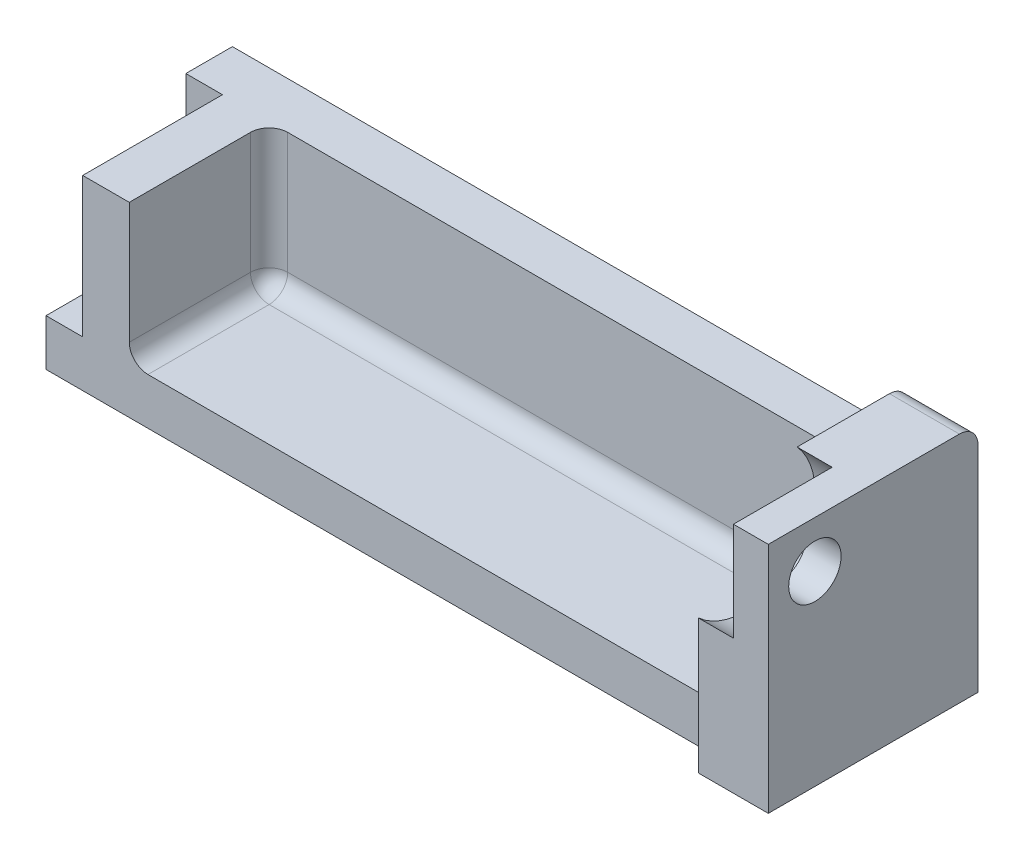
ISO-10303-21;
HEADER;
FILE_DESCRIPTION(('STEP AP214'),'2;1');
FILE_NAME('part.step','',(''),(''),'','','');
FILE_SCHEMA(('AUTOMOTIVE_DESIGN { 1 0 10303 214 1 1 1 1 }'));
ENDSEC;
DATA;
#1=APPLICATION_CONTEXT('core data for automotive mechanical design processes');
#2=APPLICATION_PROTOCOL_DEFINITION('international standard','automotive_design',2000,#1);
#3=PRODUCT_CONTEXT('',#1,'mechanical');
#4=PRODUCT('Part','Part','',(#3));
#5=PRODUCT_RELATED_PRODUCT_CATEGORY('part','',(#4));
#6=PRODUCT_DEFINITION_FORMATION('','',#4);
#7=PRODUCT_DEFINITION_CONTEXT('part definition',#1,'design');
#8=PRODUCT_DEFINITION('design','',#6,#7);
#9=PRODUCT_DEFINITION_SHAPE('','',#8);
#10=(LENGTH_UNIT() NAMED_UNIT(*) SI_UNIT(.MILLI.,.METRE.));
#11=(NAMED_UNIT(*) PLANE_ANGLE_UNIT() SI_UNIT($,.RADIAN.));
#12=(NAMED_UNIT(*) SI_UNIT($,.STERADIAN.) SOLID_ANGLE_UNIT());
#13=UNCERTAINTY_MEASURE_WITH_UNIT(LENGTH_MEASURE(1.E-05),#10,'distance_accuracy_value','');
#14=(GEOMETRIC_REPRESENTATION_CONTEXT(3) GLOBAL_UNCERTAINTY_ASSIGNED_CONTEXT((#13)) GLOBAL_UNIT_ASSIGNED_CONTEXT((#10,
#11,#12)) REPRESENTATION_CONTEXT('',''));
#15=CARTESIAN_POINT('',(0.,0.,0.));
#16=DIRECTION('',(0.,0.,1.));
#17=DIRECTION('',(1.,0.,0.));
#18=AXIS2_PLACEMENT_3D('',#15,#16,#17);
#19=CARTESIAN_POINT('',(-66.8759493670886,63.2320675105485,25.4));
#20=DIRECTION('',(0.,-1.,0.));
#21=DIRECTION('',(0.,0.,-1.));
#22=AXIS2_PLACEMENT_3D('',#19,#20,#21);
#23=PLANE('',#22);
#24=DIRECTION('',(-1.,0.,0.));
#25=VECTOR('',#24,1.);
#26=CARTESIAN_POINT('',(-55.5259493670886,63.2320675105485,6.35));
#27=LINE('',#26,#25);
#28=CARTESIAN_POINT('',(22.6590506329114,63.2320675105485,6.35));
#29=VERTEX_POINT('',#28);
#30=CARTESIAN_POINT('',(-52.9859493670886,63.2320675105485,6.35));
#31=VERTEX_POINT('',#30);
#32=EDGE_CURVE('E262',#29,#31,#27,.T.);
#33=ORIENTED_EDGE('',*,*,#32,.F.);
#34=DIRECTION('',(0.,0.,1.));
#35=VECTOR('',#34,1.);
#36=CARTESIAN_POINT('',(22.6590506329114,63.2320675105485,0.));
#37=LINE('',#36,#35);
#38=CARTESIAN_POINT('',(22.6590506329114,63.2320675105485,0.));
#39=VERTEX_POINT('',#38);
#40=EDGE_CURVE('E59',#29,#39,#37,.F.);
#41=ORIENTED_EDGE('',*,*,#40,.T.);
#42=DIRECTION('',(-1.,0.,0.));
#43=VECTOR('',#42,1.);
#44=CARTESIAN_POINT('',(-66.8759493670886,63.2320675105485,0.));
#45=LINE('',#44,#43);
#46=CARTESIAN_POINT('',(-66.8759493670886,63.2320675105485,0.));
#47=VERTEX_POINT('',#46);
#48=EDGE_CURVE('E272',#39,#47,#45,.T.);
#49=ORIENTED_EDGE('',*,*,#48,.T.);
#50=DIRECTION('',(0.,0.,-1.));
#51=VECTOR('',#50,1.);
#52=CARTESIAN_POINT('',(-66.8759493670886,63.2320675105485,25.4));
#53=LINE('',#52,#51);
#54=CARTESIAN_POINT('',(-66.8759493670886,63.2320675105485,6.35));
#55=VERTEX_POINT('',#54);
#56=EDGE_CURVE('E278',#55,#47,#53,.T.);
#57=ORIENTED_EDGE('',*,*,#56,.F.);
#58=DIRECTION('',(-1.,0.,0.));
#59=VECTOR('',#58,1.);
#60=CARTESIAN_POINT('',(-61.8759493670886,63.2320675105485,6.35));
#61=LINE('',#60,#59);
#62=CARTESIAN_POINT('',(-61.8759493670886,63.2320675105485,6.35));
#63=VERTEX_POINT('',#62);
#64=EDGE_CURVE('E247',#63,#55,#61,.T.);
#65=ORIENTED_EDGE('',*,*,#64,.F.);
#66=DIRECTION('',(0.,0.,-1.));
#67=VECTOR('',#66,1.);
#68=CARTESIAN_POINT('',(-61.8759493670886,63.2320675105485,25.4));
#69=LINE('',#68,#67);
#70=CARTESIAN_POINT('',(-61.8759493670886,63.2320675105485,25.4));
#71=VERTEX_POINT('',#70);
#72=EDGE_CURVE('E238',#71,#63,#69,.T.);
#73=ORIENTED_EDGE('',*,*,#72,.F.);
#74=DIRECTION('',(-1.,0.,0.));
#75=VECTOR('',#74,1.);
#76=CARTESIAN_POINT('',(-66.8759493670886,63.2320675105485,25.4));
#77=LINE('',#76,#75);
#78=CARTESIAN_POINT('',(-55.5259493670886,63.2320675105485,25.4));
#79=VERTEX_POINT('',#78);
#80=EDGE_CURVE('E275',#79,#71,#77,.T.);
#81=ORIENTED_EDGE('',*,*,#80,.F.);
#82=DIRECTION('',(0.,0.,1.));
#83=VECTOR('',#82,1.);
#84=CARTESIAN_POINT('',(-55.5259493670886,63.2320675105485,25.4));
#85=LINE('',#84,#83);
#86=CARTESIAN_POINT('',(-55.5259493670886,63.2320675105485,8.89));
#87=VERTEX_POINT('',#86);
#88=EDGE_CURVE('E254',#87,#79,#85,.T.);
#89=ORIENTED_EDGE('',*,*,#88,.F.);
#90=CARTESIAN_POINT('',(-52.9859493670886,63.2320675105485,8.89));
#91=DIRECTION('',(0.,-1.,0.));
#92=DIRECTION('',(0.,0.,-1.));
#93=AXIS2_PLACEMENT_3D('',#90,#91,#92);
#94=CIRCLE('',#93,2.54);
#95=EDGE_CURVE('E329',#87,#31,#94,.T.);
#96=ORIENTED_EDGE('',*,*,#95,.T.);
#97=EDGE_LOOP('',(#33,#41,#49,#57,#65,#73,#81,#89,#96));
#98=FACE_BOUND('',#97,.T.);
#99=ADVANCED_FACE('F34',(#98),#23,.F.);
#100=CARTESIAN_POINT('',(-66.8759493670886,63.2320675105485,25.4));
#101=DIRECTION('',(1.,0.,0.));
#102=DIRECTION('',(0.,1.,0.));
#103=AXIS2_PLACEMENT_3D('',#100,#101,#102);
#104=PLANE('',#103);
#105=DIRECTION('',(0.,-1.,0.));
#106=VECTOR('',#105,1.);
#107=CARTESIAN_POINT('',(-66.8759493670886,63.2320675105485,25.4));
#108=LINE('',#107,#106);
#109=CARTESIAN_POINT('',(-66.8759493670886,44.1820675105485,25.4));
#110=VERTEX_POINT('',#109);
#111=CARTESIAN_POINT('',(-66.8759493670886,37.8320675105485,25.4));
#112=VERTEX_POINT('',#111);
#113=EDGE_CURVE('E269',#110,#112,#108,.T.);
#114=ORIENTED_EDGE('',*,*,#113,.F.);
#115=DIRECTION('',(0.,0.,1.));
#116=VECTOR('',#115,1.);
#117=CARTESIAN_POINT('',(-66.8759493670886,44.1820675105485,25.4));
#118=LINE('',#117,#116);
#119=CARTESIAN_POINT('',(-66.8759493670886,44.1820675105485,6.35));
#120=VERTEX_POINT('',#119);
#121=EDGE_CURVE('E239',#120,#110,#118,.T.);
#122=ORIENTED_EDGE('',*,*,#121,.F.);
#123=DIRECTION('',(0.,-1.,0.));
#124=VECTOR('',#123,1.);
#125=CARTESIAN_POINT('',(-66.8759493670886,63.2320675105485,6.35));
#126=LINE('',#125,#124);
#127=EDGE_CURVE('E235',#55,#120,#126,.T.);
#128=ORIENTED_EDGE('',*,*,#127,.F.);
#129=ORIENTED_EDGE('',*,*,#56,.T.);
#130=DIRECTION('',(0.,-1.,0.));
#131=VECTOR('',#130,1.);
#132=CARTESIAN_POINT('',(-66.8759493670886,63.2320675105485,0.));
#133=LINE('',#132,#131);
#134=CARTESIAN_POINT('',(-66.8759493670886,37.8320675105485,0.));
#135=VERTEX_POINT('',#134);
#136=EDGE_CURVE('E268',#47,#135,#133,.T.);
#137=ORIENTED_EDGE('',*,*,#136,.T.);
#138=DIRECTION('',(0.,0.,-1.));
#139=VECTOR('',#138,1.);
#140=CARTESIAN_POINT('',(-66.8759493670886,37.8320675105485,25.4));
#141=LINE('',#140,#139);
#142=EDGE_CURVE('E192',#112,#135,#141,.T.);
#143=ORIENTED_EDGE('',*,*,#142,.F.);
#144=EDGE_LOOP('',(#114,#122,#128,#129,#137,#143));
#145=FACE_BOUND('',#144,.T.);
#146=ADVANCED_FACE('F420',(#145),#104,.F.);
#147=CARTESIAN_POINT('',(-66.8759493670886,37.8320675105485,25.4));
#148=DIRECTION('',(0.,1.,0.));
#149=DIRECTION('',(0.,0.,1.));
#150=AXIS2_PLACEMENT_3D('',#147,#148,#149);
#151=PLANE('',#150);
#152=DIRECTION('',(1.,0.,0.));
#153=VECTOR('',#152,1.);
#154=CARTESIAN_POINT('',(-66.8759493670886,37.8320675105485,0.));
#155=LINE('',#154,#153);
#156=CARTESIAN_POINT('',(34.7240506329114,37.8320675105485,0.));
#157=VERTEX_POINT('',#156);
#158=EDGE_CURVE('E281',#135,#157,#155,.T.);
#159=ORIENTED_EDGE('',*,*,#158,.T.);
#160=DIRECTION('',(0.,0.,-1.));
#161=VECTOR('',#160,1.);
#162=CARTESIAN_POINT('',(34.7240506329114,37.8320675105485,25.4));
#163=LINE('',#162,#161);
#164=CARTESIAN_POINT('',(34.7240506329114,37.8320675105485,28.575));
#165=VERTEX_POINT('',#164);
#166=EDGE_CURVE('E288',#165,#157,#163,.T.);
#167=ORIENTED_EDGE('',*,*,#166,.F.);
#168=DIRECTION('',(1.,0.,0.));
#169=VECTOR('',#168,1.);
#170=CARTESIAN_POINT('',(25.1990506329114,37.8320675105485,28.575));
#171=LINE('',#170,#169);
#172=CARTESIAN_POINT('',(25.1990506329114,37.8320675105485,28.575));
#173=VERTEX_POINT('',#172);
#174=EDGE_CURVE('E226',#173,#165,#171,.T.);
#175=ORIENTED_EDGE('',*,*,#174,.F.);
#176=DIRECTION('',(0.,0.,-1.));
#177=VECTOR('',#176,1.);
#178=CARTESIAN_POINT('',(25.1990506329114,37.8320675105485,28.575));
#179=LINE('',#178,#177);
#180=CARTESIAN_POINT('',(25.1990506329114,37.8320675105485,27.94));
#181=VERTEX_POINT('',#180);
#182=EDGE_CURVE('E232',#173,#181,#179,.T.);
#183=ORIENTED_EDGE('',*,*,#182,.T.);
#184=CARTESIAN_POINT('',(22.6590506329114,37.8320675105485,27.94));
#185=DIRECTION('',(0.,1.,0.));
#186=DIRECTION('',(0.,0.,1.));
#187=AXIS2_PLACEMENT_3D('',#184,#185,#186);
#188=CIRCLE('',#187,2.54);
#189=CARTESIAN_POINT('',(22.6590506329114,37.8320675105485,25.4));
#190=VERTEX_POINT('',#189);
#191=EDGE_CURVE('E43',#181,#190,#188,.T.);
#192=ORIENTED_EDGE('',*,*,#191,.T.);
#193=DIRECTION('',(1.,0.,0.));
#194=VECTOR('',#193,1.);
#195=CARTESIAN_POINT('',(-66.8759493670886,37.8320675105485,25.4));
#196=LINE('',#195,#194);
#197=EDGE_CURVE('E271',#112,#190,#196,.T.);
#198=ORIENTED_EDGE('',*,*,#197,.F.);
#199=ORIENTED_EDGE('',*,*,#142,.T.);
#200=EDGE_LOOP('',(#159,#167,#175,#183,#192,#198,#199));
#201=FACE_BOUND('',#200,.T.);
#202=ADVANCED_FACE('F373',(#201),#151,.F.);
#203=CARTESIAN_POINT('',(34.7240506329114,63.2320675105485,25.4));
#204=DIRECTION('',(-1.,0.,0.));
#205=DIRECTION('',(0.,-1.,0.));
#206=AXIS2_PLACEMENT_3D('',#203,#204,#205);
#207=PLANE('',#206);
#208=CARTESIAN_POINT('',(34.7240506329114,63.2320675105485,22.225));
#209=DIRECTION('',(-1.,0.,0.));
#210=DIRECTION('',(0.,-1.,0.));
#211=AXIS2_PLACEMENT_3D('',#208,#209,#210);
#212=CIRCLE('',#211,3.57124);
#213=CARTESIAN_POINT('',(34.7240506329114,59.6608275105485,22.225));
#214=VERTEX_POINT('',#213);
#215=EDGE_CURVE('E215',#214,#214,#212,.T.);
#216=ORIENTED_EDGE('',*,*,#215,.T.);
#217=EDGE_LOOP('',(#216));
#218=FACE_BOUND('',#217,.T.);
#219=DIRECTION('',(0.,1.,0.));
#220=VECTOR('',#219,1.);
#221=CARTESIAN_POINT('',(34.7240506329114,63.2320675105485,0.));
#222=LINE('',#221,#220);
#223=CARTESIAN_POINT('',(34.7240506329114,67.0420675105485,0.));
#224=VERTEX_POINT('',#223);
#225=EDGE_CURVE('E283',#157,#224,#222,.T.);
#226=ORIENTED_EDGE('',*,*,#225,.T.);
#227=CARTESIAN_POINT('',(34.7240506329114,67.0420675105485,2.54));
#228=DIRECTION('',(-1.,0.,0.));
#229=DIRECTION('',(0.,-1.,0.));
#230=AXIS2_PLACEMENT_3D('',#227,#228,#229);
#231=CIRCLE('',#230,2.54);
#232=CARTESIAN_POINT('',(34.7240506329114,69.5820675105485,2.54));
#233=VERTEX_POINT('',#232);
#234=EDGE_CURVE('E326',#224,#233,#231,.F.);
#235=ORIENTED_EDGE('',*,*,#234,.T.);
#236=DIRECTION('',(0.,0.,-1.));
#237=VECTOR('',#236,1.);
#238=CARTESIAN_POINT('',(34.7240506329114,69.5820675105485,0.));
#239=LINE('',#238,#237);
#240=CARTESIAN_POINT('',(34.7240506329114,69.5820675105485,28.575));
#241=VERTEX_POINT('',#240);
#242=EDGE_CURVE('E216',#241,#233,#239,.T.);
#243=ORIENTED_EDGE('',*,*,#242,.F.);
#244=DIRECTION('',(0.,1.,0.));
#245=VECTOR('',#244,1.);
#246=CARTESIAN_POINT('',(34.7240506329114,63.2320675105485,28.575));
#247=LINE('',#246,#245);
#248=EDGE_CURVE('E229',#165,#241,#247,.T.);
#249=ORIENTED_EDGE('',*,*,#248,.F.);
#250=ORIENTED_EDGE('',*,*,#166,.T.);
#251=EDGE_LOOP('',(#226,#235,#243,#249,#250));
#252=FACE_BOUND('',#251,.T.);
#253=ADVANCED_FACE('F428',(#218,#252),#207,.F.);
#254=CARTESIAN_POINT('',(0.,0.,25.4));
#255=DIRECTION('',(0.,0.,1.));
#256=DIRECTION('',(1.,0.,0.));
#257=AXIS2_PLACEMENT_3D('',#254,#255,#256);
#258=PLANE('',#257);
#259=ORIENTED_EDGE('',*,*,#197,.T.);
#260=DIRECTION('',(0.,-1.,0.));
#261=VECTOR('',#260,1.);
#262=CARTESIAN_POINT('',(22.6590506329114,0.,25.4));
#263=LINE('',#262,#261);
#264=CARTESIAN_POINT('',(22.6590506329114,44.1820675105485,25.4));
#265=VERTEX_POINT('',#264);
#266=EDGE_CURVE('E321',#190,#265,#263,.F.);
#267=ORIENTED_EDGE('',*,*,#266,.T.);
#268=DIRECTION('',(1.,0.,0.));
#269=VECTOR('',#268,1.);
#270=CARTESIAN_POINT('',(-55.5259493670886,44.1820675105485,25.4));
#271=LINE('',#270,#269);
#272=CARTESIAN_POINT('',(-52.9859493670886,44.1820675105485,25.4));
#273=VERTEX_POINT('',#272);
#274=EDGE_CURVE('E258',#273,#265,#271,.T.);
#275=ORIENTED_EDGE('',*,*,#274,.F.);
#276=CARTESIAN_POINT('',(-52.9859493670886,46.7220675105485,25.4));
#277=DIRECTION('',(0.,0.,1.));
#278=DIRECTION('',(1.,0.,0.));
#279=AXIS2_PLACEMENT_3D('',#276,#277,#278);
#280=CIRCLE('',#279,2.54);
#281=CARTESIAN_POINT('',(-55.5259493670886,46.7220675105485,25.4));
#282=VERTEX_POINT('',#281);
#283=EDGE_CURVE('E331',#273,#282,#280,.F.);
#284=ORIENTED_EDGE('',*,*,#283,.T.);
#285=DIRECTION('',(0.,1.,0.));
#286=VECTOR('',#285,1.);
#287=CARTESIAN_POINT('',(-55.5259493670886,44.1820675105485,25.4));
#288=LINE('',#287,#286);
#289=EDGE_CURVE('E261',#282,#79,#288,.T.);
#290=ORIENTED_EDGE('',*,*,#289,.T.);
#291=ORIENTED_EDGE('',*,*,#80,.T.);
#292=DIRECTION('',(0.,1.,0.));
#293=VECTOR('',#292,1.);
#294=CARTESIAN_POINT('',(-61.8759493670886,63.2320675105485,25.4));
#295=LINE('',#294,#293);
#296=CARTESIAN_POINT('',(-61.8759493670886,44.1820675105485,25.4));
#297=VERTEX_POINT('',#296);
#298=EDGE_CURVE('E236',#297,#71,#295,.T.);
#299=ORIENTED_EDGE('',*,*,#298,.F.);
#300=DIRECTION('',(-1.,0.,0.));
#301=VECTOR('',#300,1.);
#302=CARTESIAN_POINT('',(-61.8759493670886,44.1820675105485,25.4));
#303=LINE('',#302,#301);
#304=EDGE_CURVE('E251',#297,#110,#303,.T.);
#305=ORIENTED_EDGE('',*,*,#304,.T.);
#306=ORIENTED_EDGE('',*,*,#113,.T.);
#307=EDGE_LOOP('',(#259,#267,#275,#284,#290,#291,#299,#305,#306));
#308=FACE_BOUND('',#307,.T.);
#309=ADVANCED_FACE('F380',(#308),#258,.T.);
#310=CARTESIAN_POINT('',(0.,0.,0.));
#311=DIRECTION('',(0.,0.,1.));
#312=DIRECTION('',(1.,0.,0.));
#313=AXIS2_PLACEMENT_3D('',#310,#311,#312);
#314=PLANE('',#313);
#315=DIRECTION('',(0.,-1.,0.));
#316=VECTOR('',#315,1.);
#317=CARTESIAN_POINT('',(25.1990506329114,69.5820675105485,0.));
#318=LINE('',#317,#316);
#319=CARTESIAN_POINT('',(25.1990506329114,67.0420675105485,0.));
#320=VERTEX_POINT('',#319);
#321=CARTESIAN_POINT('',(25.1990506329114,65.7720675105485,0.));
#322=VERTEX_POINT('',#321);
#323=EDGE_CURVE('E221',#320,#322,#318,.T.);
#324=ORIENTED_EDGE('',*,*,#323,.F.);
#325=DIRECTION('',(-1.,0.,0.));
#326=VECTOR('',#325,1.);
#327=CARTESIAN_POINT('',(0.,67.0420675105485,0.));
#328=LINE('',#327,#326);
#329=EDGE_CURVE('E51',#320,#224,#328,.F.);
#330=ORIENTED_EDGE('',*,*,#329,.T.);
#331=ORIENTED_EDGE('',*,*,#225,.F.);
#332=ORIENTED_EDGE('',*,*,#158,.F.);
#333=ORIENTED_EDGE('',*,*,#136,.F.);
#334=ORIENTED_EDGE('',*,*,#48,.F.);
#335=CARTESIAN_POINT('',(22.6590506329114,65.7720675105485,0.));
#336=DIRECTION('',(0.,0.,1.));
#337=DIRECTION('',(1.,0.,0.));
#338=AXIS2_PLACEMENT_3D('',#335,#336,#337);
#339=CIRCLE('',#338,2.54);
#340=EDGE_CURVE('E11',#39,#322,#339,.T.);
#341=ORIENTED_EDGE('',*,*,#340,.T.);
#342=EDGE_LOOP('',(#324,#330,#331,#332,#333,#334,#341));
#343=FACE_BOUND('',#342,.T.);
#344=ADVANCED_FACE('F424',(#343),#314,.F.);
#345=CARTESIAN_POINT('',(-55.5259493670886,44.1820675105485,25.4));
#346=DIRECTION('',(-1.,0.,0.));
#347=DIRECTION('',(0.,0.,1.));
#348=AXIS2_PLACEMENT_3D('',#345,#346,#347);
#349=PLANE('',#348);
#350=DIRECTION('',(0.,0.,1.));
#351=VECTOR('',#350,1.);
#352=CARTESIAN_POINT('',(-55.5259493670886,46.7220675105485,6.35));
#353=LINE('',#352,#351);
#354=CARTESIAN_POINT('',(-55.5259493670886,46.7220675105485,8.89));
#355=VERTEX_POINT('',#354);
#356=EDGE_CURVE('E191',#282,#355,#353,.F.);
#357=ORIENTED_EDGE('',*,*,#356,.T.);
#358=DIRECTION('',(0.,1.,0.));
#359=VECTOR('',#358,1.);
#360=CARTESIAN_POINT('',(-55.5259493670886,63.2320675105485,8.89));
#361=LINE('',#360,#359);
#362=EDGE_CURVE('E296',#355,#87,#361,.T.);
#363=ORIENTED_EDGE('',*,*,#362,.T.);
#364=ORIENTED_EDGE('',*,*,#88,.T.);
#365=ORIENTED_EDGE('',*,*,#289,.F.);
#366=EDGE_LOOP('',(#357,#363,#364,#365));
#367=FACE_BOUND('',#366,.T.);
#368=ADVANCED_FACE('F404',(#367),#349,.F.);
#369=CARTESIAN_POINT('',(-55.5259493670886,44.1820675105485,6.35));
#370=DIRECTION('',(0.,0.,-1.));
#371=DIRECTION('',(-1.,0.,0.));
#372=AXIS2_PLACEMENT_3D('',#369,#370,#371);
#373=PLANE('',#372);
#374=ORIENTED_EDGE('',*,*,#32,.T.);
#375=DIRECTION('',(0.,1.,0.));
#376=VECTOR('',#375,1.);
#377=CARTESIAN_POINT('',(-52.9859493670886,44.1820675105485,6.35));
#378=LINE('',#377,#376);
#379=CARTESIAN_POINT('',(-52.9859493670886,46.7220675105485,6.35));
#380=VERTEX_POINT('',#379);
#381=EDGE_CURVE('E303',#31,#380,#378,.F.);
#382=ORIENTED_EDGE('',*,*,#381,.T.);
#383=DIRECTION('',(-1.,0.,0.));
#384=VECTOR('',#383,1.);
#385=CARTESIAN_POINT('',(25.1990506329114,46.7220675105485,6.35));
#386=LINE('',#385,#384);
#387=CARTESIAN_POINT('',(22.6590506329114,46.7220675105485,6.35));
#388=VERTEX_POINT('',#387);
#389=EDGE_CURVE('E301',#380,#388,#386,.F.);
#390=ORIENTED_EDGE('',*,*,#389,.T.);
#391=DIRECTION('',(0.,1.,0.));
#392=VECTOR('',#391,1.);
#393=CARTESIAN_POINT('',(22.6590506329114,63.2320675105485,6.35));
#394=LINE('',#393,#392);
#395=EDGE_CURVE('E299',#388,#29,#394,.T.);
#396=ORIENTED_EDGE('',*,*,#395,.T.);
#397=EDGE_LOOP('',(#374,#382,#390,#396));
#398=FACE_BOUND('',#397,.T.);
#399=ADVANCED_FACE('F579',(#398),#373,.F.);
#400=CARTESIAN_POINT('',(25.1990506329114,44.1820675105485,25.4));
#401=DIRECTION('',(1.,0.,0.));
#402=DIRECTION('',(0.,0.,-1.));
#403=AXIS2_PLACEMENT_3D('',#400,#401,#402);
#404=PLANE('',#403);
#405=DIRECTION('',(0.,0.,1.));
#406=VECTOR('',#405,1.);
#407=CARTESIAN_POINT('',(25.1990506329114,69.5820675105485,0.));
#408=LINE('',#407,#406);
#409=CARTESIAN_POINT('',(25.1990506329114,69.5820675105485,2.54));
#410=VERTEX_POINT('',#409);
#411=CARTESIAN_POINT('',(25.1990506329114,69.5820675105485,15.1254841714382));
#412=VERTEX_POINT('',#411);
#413=EDGE_CURVE('E208',#410,#412,#408,.T.);
#414=ORIENTED_EDGE('',*,*,#413,.F.);
#415=CARTESIAN_POINT('',(25.1990506329114,67.0420675105485,2.54));
#416=DIRECTION('',(1.,0.,0.));
#417=DIRECTION('',(0.,0.,-1.));
#418=AXIS2_PLACEMENT_3D('',#415,#416,#417);
#419=CIRCLE('',#418,2.54);
#420=EDGE_CURVE('E319',#410,#320,#419,.F.);
#421=ORIENTED_EDGE('',*,*,#420,.T.);
#422=ORIENTED_EDGE('',*,*,#323,.T.);
#423=DIRECTION('',(0.,0.,1.));
#424=VECTOR('',#423,1.);
#425=CARTESIAN_POINT('',(25.1990506329114,65.7720675105485,6.35));
#426=LINE('',#425,#424);
#427=CARTESIAN_POINT('',(25.1990506329114,65.7720675105485,8.89));
#428=VERTEX_POINT('',#427);
#429=EDGE_CURVE('E311',#322,#428,#426,.T.);
#430=ORIENTED_EDGE('',*,*,#429,.T.);
#431=DIRECTION('',(0.,1.,0.));
#432=VECTOR('',#431,1.);
#433=CARTESIAN_POINT('',(25.1990506329114,44.1820675105485,8.89));
#434=LINE('',#433,#432);
#435=CARTESIAN_POINT('',(25.1990506329114,46.7220675105485,8.89));
#436=VERTEX_POINT('',#435);
#437=EDGE_CURVE('E313',#428,#436,#434,.F.);
#438=ORIENTED_EDGE('',*,*,#437,.T.);
#439=DIRECTION('',(0.,0.,-1.));
#440=VECTOR('',#439,1.);
#441=CARTESIAN_POINT('',(25.1990506329114,46.7220675105485,25.4));
#442=LINE('',#441,#440);
#443=CARTESIAN_POINT('',(25.1990506329114,46.7220675105485,27.94));
#444=VERTEX_POINT('',#443);
#445=EDGE_CURVE('E315',#436,#444,#442,.F.);
#446=ORIENTED_EDGE('',*,*,#445,.T.);
#447=DIRECTION('',(0.,-1.,0.));
#448=VECTOR('',#447,1.);
#449=CARTESIAN_POINT('',(25.1990506329114,44.1820675105485,27.94));
#450=LINE('',#449,#448);
#451=EDGE_CURVE('E317',#444,#181,#450,.T.);
#452=ORIENTED_EDGE('',*,*,#451,.T.);
#453=ORIENTED_EDGE('',*,*,#182,.F.);
#454=DIRECTION('',(0.,-1.,0.));
#455=VECTOR('',#454,1.);
#456=CARTESIAN_POINT('',(25.1990506329114,63.2320675105485,28.575));
#457=LINE('',#456,#455);
#458=CARTESIAN_POINT('',(25.1990506329114,56.1325516819867,28.575));
#459=VERTEX_POINT('',#458);
#460=EDGE_CURVE('E224',#459,#173,#457,.T.);
#461=ORIENTED_EDGE('',*,*,#460,.F.);
#462=CARTESIAN_POINT('',(25.1990506329114,63.2320675105485,22.225));
#463=DIRECTION('',(-1.,0.,0.));
#464=DIRECTION('',(0.,0.,1.));
#465=AXIS2_PLACEMENT_3D('',#462,#463,#464);
#466=CIRCLE('',#465,9.52499999999999);
#467=EDGE_CURVE('E202',#412,#459,#466,.T.);
#468=ORIENTED_EDGE('',*,*,#467,.F.);
#469=EDGE_LOOP('',(#414,#421,#422,#430,#438,#446,#452,#453,#461,#468));
#470=FACE_BOUND('',#469,.T.);
#471=ADVANCED_FACE('F369',(#470),#404,.F.);
#472=CARTESIAN_POINT('',(0.,44.1820675105485,0.));
#473=DIRECTION('',(0.,-1.,0.));
#474=DIRECTION('',(0.,0.,-1.));
#475=AXIS2_PLACEMENT_3D('',#472,#473,#474);
#476=PLANE('',#475);
#477=DIRECTION('',(-1.,0.,0.));
#478=VECTOR('',#477,1.);
#479=CARTESIAN_POINT('',(-55.5259493670886,44.1820675105485,8.89));
#480=LINE('',#479,#478);
#481=CARTESIAN_POINT('',(22.6590506329114,44.1820675105485,8.89));
#482=VERTEX_POINT('',#481);
#483=CARTESIAN_POINT('',(-52.9859493670886,44.1820675105485,8.89));
#484=VERTEX_POINT('',#483);
#485=EDGE_CURVE('E307',#482,#484,#480,.T.);
#486=ORIENTED_EDGE('',*,*,#485,.T.);
#487=DIRECTION('',(0.,0.,1.));
#488=VECTOR('',#487,1.);
#489=CARTESIAN_POINT('',(-52.9859493670886,44.1820675105485,25.4));
#490=LINE('',#489,#488);
#491=EDGE_CURVE('E309',#484,#273,#490,.T.);
#492=ORIENTED_EDGE('',*,*,#491,.T.);
#493=ORIENTED_EDGE('',*,*,#274,.T.);
#494=DIRECTION('',(0.,0.,-1.));
#495=VECTOR('',#494,1.);
#496=CARTESIAN_POINT('',(22.6590506329114,44.1820675105485,6.35));
#497=LINE('',#496,#495);
#498=EDGE_CURVE('E305',#265,#482,#497,.T.);
#499=ORIENTED_EDGE('',*,*,#498,.T.);
#500=EDGE_LOOP('',(#486,#492,#493,#499));
#501=FACE_BOUND('',#500,.T.);
#502=ADVANCED_FACE('F383',(#501),#476,.F.);
#503=CARTESIAN_POINT('',(-61.8759493670886,44.1820675105485,25.4));
#504=DIRECTION('',(0.,-1.,0.));
#505=DIRECTION('',(1.,0.,0.));
#506=AXIS2_PLACEMENT_3D('',#503,#504,#505);
#507=PLANE('',#506);
#508=ORIENTED_EDGE('',*,*,#121,.T.);
#509=ORIENTED_EDGE('',*,*,#304,.F.);
#510=DIRECTION('',(0.,0.,1.));
#511=VECTOR('',#510,1.);
#512=CARTESIAN_POINT('',(-61.8759493670886,44.1820675105485,25.4));
#513=LINE('',#512,#511);
#514=CARTESIAN_POINT('',(-61.8759493670886,44.1820675105485,6.35));
#515=VERTEX_POINT('',#514);
#516=EDGE_CURVE('E245',#515,#297,#513,.T.);
#517=ORIENTED_EDGE('',*,*,#516,.F.);
#518=DIRECTION('',(-1.,0.,0.));
#519=VECTOR('',#518,1.);
#520=CARTESIAN_POINT('',(-61.8759493670886,44.1820675105485,6.35));
#521=LINE('',#520,#519);
#522=EDGE_CURVE('E255',#515,#120,#521,.T.);
#523=ORIENTED_EDGE('',*,*,#522,.T.);
#524=EDGE_LOOP('',(#508,#509,#517,#523));
#525=FACE_BOUND('',#524,.T.);
#526=ADVANCED_FACE('F416',(#525),#507,.F.);
#527=CARTESIAN_POINT('',(-61.8759493670886,63.2320675105485,6.35));
#528=DIRECTION('',(0.,0.,-1.));
#529=DIRECTION('',(-1.,0.,0.));
#530=AXIS2_PLACEMENT_3D('',#527,#528,#529);
#531=PLANE('',#530);
#532=ORIENTED_EDGE('',*,*,#127,.T.);
#533=ORIENTED_EDGE('',*,*,#522,.F.);
#534=DIRECTION('',(0.,-1.,0.));
#535=VECTOR('',#534,1.);
#536=CARTESIAN_POINT('',(-61.8759493670886,63.2320675105485,6.35));
#537=LINE('',#536,#535);
#538=EDGE_CURVE('E242',#63,#515,#537,.T.);
#539=ORIENTED_EDGE('',*,*,#538,.F.);
#540=ORIENTED_EDGE('',*,*,#64,.T.);
#541=EDGE_LOOP('',(#532,#533,#539,#540));
#542=FACE_BOUND('',#541,.T.);
#543=ADVANCED_FACE('F648',(#542),#531,.F.);
#544=CARTESIAN_POINT('',(-61.8759493670886,0.,0.));
#545=DIRECTION('',(1.,0.,0.));
#546=DIRECTION('',(0.,0.,-1.));
#547=AXIS2_PLACEMENT_3D('',#544,#545,#546);
#548=PLANE('',#547);
#549=ORIENTED_EDGE('',*,*,#298,.T.);
#550=ORIENTED_EDGE('',*,*,#72,.T.);
#551=ORIENTED_EDGE('',*,*,#538,.T.);
#552=ORIENTED_EDGE('',*,*,#516,.T.);
#553=EDGE_LOOP('',(#549,#550,#551,#552));
#554=FACE_BOUND('',#553,.T.);
#555=ADVANCED_FACE('F413',(#554),#548,.F.);
#556=CARTESIAN_POINT('',(0.,0.,28.575));
#557=DIRECTION('',(0.,0.,1.));
#558=DIRECTION('',(1.,0.,0.));
#559=AXIS2_PLACEMENT_3D('',#556,#557,#558);
#560=PLANE('',#559);
#561=DIRECTION('',(-1.,0.,0.));
#562=VECTOR('',#561,1.);
#563=CARTESIAN_POINT('',(25.1990506329114,56.1325516819867,28.575));
#564=LINE('',#563,#562);
#565=CARTESIAN_POINT('',(29.9742506329114,56.1325516819867,28.575));
#566=VERTEX_POINT('',#565);
#567=EDGE_CURVE('E200',#459,#566,#564,.F.);
#568=ORIENTED_EDGE('',*,*,#567,.F.);
#569=ORIENTED_EDGE('',*,*,#460,.T.);
#570=ORIENTED_EDGE('',*,*,#174,.T.);
#571=ORIENTED_EDGE('',*,*,#248,.T.);
#572=DIRECTION('',(1.,0.,0.));
#573=VECTOR('',#572,1.);
#574=CARTESIAN_POINT('',(34.7240506329114,69.5820675105485,28.575));
#575=LINE('',#574,#573);
#576=CARTESIAN_POINT('',(29.9742506329114,69.5820675105485,28.575));
#577=VERTEX_POINT('',#576);
#578=EDGE_CURVE('E219',#577,#241,#575,.T.);
#579=ORIENTED_EDGE('',*,*,#578,.F.);
#580=DIRECTION('',(0.,1.,0.));
#581=VECTOR('',#580,1.);
#582=CARTESIAN_POINT('',(29.9742506329114,0.,28.575));
#583=LINE('',#582,#581);
#584=EDGE_CURVE('E187',#566,#577,#583,.T.);
#585=ORIENTED_EDGE('',*,*,#584,.F.);
#586=EDGE_LOOP('',(#568,#569,#570,#571,#579,#585));
#587=FACE_BOUND('',#586,.T.);
#588=ADVANCED_FACE('F366',(#587),#560,.T.);
#589=CARTESIAN_POINT('',(0.,69.5820675105485,0.));
#590=DIRECTION('',(0.,-1.,0.));
#591=DIRECTION('',(0.,0.,-1.));
#592=AXIS2_PLACEMENT_3D('',#589,#590,#591);
#593=PLANE('',#592);
#594=ORIENTED_EDGE('',*,*,#242,.T.);
#595=DIRECTION('',(-1.,0.,0.));
#596=VECTOR('',#595,1.);
#597=CARTESIAN_POINT('',(0.,69.5820675105485,2.54));
#598=LINE('',#597,#596);
#599=EDGE_CURVE('E323',#233,#410,#598,.T.);
#600=ORIENTED_EDGE('',*,*,#599,.T.);
#601=ORIENTED_EDGE('',*,*,#413,.T.);
#602=DIRECTION('',(-1.,0.,0.));
#603=VECTOR('',#602,1.);
#604=CARTESIAN_POINT('',(25.1990506329114,69.5820675105485,15.1254841714382));
#605=LINE('',#604,#603);
#606=CARTESIAN_POINT('',(29.9742506329114,69.5820675105485,15.1254841714382));
#607=VERTEX_POINT('',#606);
#608=EDGE_CURVE('E197',#412,#607,#605,.F.);
#609=ORIENTED_EDGE('',*,*,#608,.T.);
#610=DIRECTION('',(0.,0.,1.));
#611=VECTOR('',#610,1.);
#612=CARTESIAN_POINT('',(29.9742506329114,69.5820675105485,0.));
#613=LINE('',#612,#611);
#614=EDGE_CURVE('E181',#607,#577,#613,.T.);
#615=ORIENTED_EDGE('',*,*,#614,.T.);
#616=ORIENTED_EDGE('',*,*,#578,.T.);
#617=EDGE_LOOP('',(#594,#600,#601,#609,#615,#616));
#618=FACE_BOUND('',#617,.T.);
#619=ADVANCED_FACE('F205',(#618),#593,.F.);
#620=CARTESIAN_POINT('',(25.1990506329114,63.2320675105485,22.225));
#621=DIRECTION('',(-1.,0.,0.));
#622=DIRECTION('',(0.,0.,1.));
#623=AXIS2_PLACEMENT_3D('',#620,#621,#622);
#624=CYLINDRICAL_SURFACE('',#623,3.57124);
#625=CARTESIAN_POINT('',(29.9742506329114,63.2320675105485,22.225));
#626=DIRECTION('',(-1.,0.,0.));
#627=DIRECTION('',(0.,0.,1.));
#628=AXIS2_PLACEMENT_3D('',#625,#626,#627);
#629=CIRCLE('',#628,3.57124);
#630=CARTESIAN_POINT('',(29.9742506329114,63.2320675105485,25.79624));
#631=VERTEX_POINT('',#630);
#632=EDGE_CURVE('E201',#631,#631,#629,.T.);
#633=ORIENTED_EDGE('',*,*,#632,.T.);
#634=EDGE_LOOP('',(#633));
#635=FACE_BOUND('',#634,.T.);
#636=ORIENTED_EDGE('',*,*,#215,.F.);
#637=EDGE_LOOP('',(#636));
#638=FACE_BOUND('',#637,.T.);
#639=ADVANCED_FACE('F543',(#635,#638),#624,.F.);
#640=CARTESIAN_POINT('',(29.9742506329114,66.8033075105485,22.225));
#641=DIRECTION('',(1.,0.,0.));
#642=DIRECTION('',(0.,0.,-1.));
#643=AXIS2_PLACEMENT_3D('',#640,#641,#642);
#644=PLANE('',#643);
#645=ORIENTED_EDGE('',*,*,#584,.T.);
#646=ORIENTED_EDGE('',*,*,#614,.F.);
#647=CARTESIAN_POINT('',(29.9742506329114,63.2320675105485,22.225));
#648=DIRECTION('',(-1.,0.,0.));
#649=DIRECTION('',(0.,0.,1.));
#650=AXIS2_PLACEMENT_3D('',#647,#648,#649);
#651=CIRCLE('',#650,9.52499999999999);
#652=EDGE_CURVE('E185',#607,#566,#651,.T.);
#653=ORIENTED_EDGE('',*,*,#652,.T.);
#654=EDGE_LOOP('',(#645,#646,#653));
#655=FACE_BOUND('',#654,.T.);
#656=ORIENTED_EDGE('',*,*,#632,.F.);
#657=EDGE_LOOP('',(#656));
#658=FACE_BOUND('',#657,.T.);
#659=ADVANCED_FACE('F183',(#655,#658),#644,.F.);
#660=CARTESIAN_POINT('',(25.1990506329114,63.2320675105485,22.225));
#661=DIRECTION('',(-1.,0.,0.));
#662=DIRECTION('',(0.,0.,1.));
#663=AXIS2_PLACEMENT_3D('',#660,#661,#662);
#664=CYLINDRICAL_SURFACE('',#663,9.52499999999999);
#665=ORIENTED_EDGE('',*,*,#567,.T.);
#666=ORIENTED_EDGE('',*,*,#652,.F.);
#667=ORIENTED_EDGE('',*,*,#608,.F.);
#668=ORIENTED_EDGE('',*,*,#467,.T.);
#669=EDGE_LOOP('',(#665,#666,#667,#668));
#670=FACE_BOUND('',#669,.T.);
#671=ADVANCED_FACE('F196',(#670),#664,.F.);
#672=CARTESIAN_POINT('',(22.6590506329114,65.7720675105485,25.4));
#673=DIRECTION('',(0.,0.,-1.));
#674=DIRECTION('',(-1.,0.,0.));
#675=AXIS2_PLACEMENT_3D('',#672,#673,#674);
#676=CYLINDRICAL_SURFACE('',#675,2.54);
#677=ORIENTED_EDGE('',*,*,#340,.F.);
#678=ORIENTED_EDGE('',*,*,#40,.F.);
#679=CARTESIAN_POINT('',(22.6590506329114,65.7720675105485,8.89));
#680=DIRECTION('',(0.,0.707106781186547,-0.707106781186547));
#681=DIRECTION('',(0.,-0.707106781186547,-0.707106781186547));
#682=AXIS2_PLACEMENT_3D('',#679,#680,#681);
#683=ELLIPSE('',#682,3.59210244842766,2.54);
#684=EDGE_CURVE('E38',#428,#29,#683,.T.);
#685=ORIENTED_EDGE('',*,*,#684,.F.);
#686=ORIENTED_EDGE('',*,*,#429,.F.);
#687=EDGE_LOOP('',(#677,#678,#685,#686));
#688=FACE_BOUND('',#687,.T.);
#689=ADVANCED_FACE('F435',(#688),#676,.F.);
#690=CARTESIAN_POINT('',(22.6590506329114,44.1820675105485,27.94));
#691=DIRECTION('',(0.,-1.,0.));
#692=DIRECTION('',(0.,0.,-1.));
#693=AXIS2_PLACEMENT_3D('',#690,#691,#692);
#694=CYLINDRICAL_SURFACE('',#693,2.54);
#695=ORIENTED_EDGE('',*,*,#191,.F.);
#696=ORIENTED_EDGE('',*,*,#451,.F.);
#697=CARTESIAN_POINT('',(22.6590506329114,46.7220675105485,27.94));
#698=DIRECTION('',(0.,-0.707106781186547,0.707106781186547));
#699=DIRECTION('',(0.,-0.707106781186547,-0.707106781186547));
#700=AXIS2_PLACEMENT_3D('',#697,#698,#699);
#701=ELLIPSE('',#700,3.59210244842766,2.54);
#702=EDGE_CURVE('E351',#265,#444,#701,.T.);
#703=ORIENTED_EDGE('',*,*,#702,.F.);
#704=ORIENTED_EDGE('',*,*,#266,.F.);
#705=EDGE_LOOP('',(#695,#696,#703,#704));
#706=FACE_BOUND('',#705,.T.);
#707=ADVANCED_FACE('F377',(#706),#694,.F.);
#708=CARTESIAN_POINT('',(22.6590506329114,44.1820675105485,8.89));
#709=DIRECTION('',(0.,-1.,0.));
#710=DIRECTION('',(0.,0.,-1.));
#711=AXIS2_PLACEMENT_3D('',#708,#709,#710);
#712=CYLINDRICAL_SURFACE('',#711,2.54);
#713=ORIENTED_EDGE('',*,*,#684,.T.);
#714=ORIENTED_EDGE('',*,*,#395,.F.);
#715=CARTESIAN_POINT('',(22.6590506329114,46.7220675105485,8.89));
#716=DIRECTION('',(0.,1.,0.));
#717=DIRECTION('',(0.,0.,1.));
#718=AXIS2_PLACEMENT_3D('',#715,#716,#717);
#719=CIRCLE('',#718,2.54);
#720=EDGE_CURVE('E349',#436,#388,#719,.T.);
#721=ORIENTED_EDGE('',*,*,#720,.F.);
#722=ORIENTED_EDGE('',*,*,#437,.F.);
#723=EDGE_LOOP('',(#713,#714,#721,#722));
#724=FACE_BOUND('',#723,.T.);
#725=ADVANCED_FACE('F439',(#724),#712,.F.);
#726=CARTESIAN_POINT('',(22.6590506329114,46.7220675105485,0.));
#727=DIRECTION('',(0.,0.,1.));
#728=DIRECTION('',(1.,0.,0.));
#729=AXIS2_PLACEMENT_3D('',#726,#727,#728);
#730=CYLINDRICAL_SURFACE('',#729,2.54);
#731=ORIENTED_EDGE('',*,*,#702,.T.);
#732=ORIENTED_EDGE('',*,*,#445,.F.);
#733=CARTESIAN_POINT('',(22.6590506329114,46.7220675105485,8.89));
#734=DIRECTION('',(0.,0.,1.));
#735=DIRECTION('',(1.,0.,0.));
#736=AXIS2_PLACEMENT_3D('',#733,#734,#735);
#737=CIRCLE('',#736,2.54);
#738=EDGE_CURVE('E346',#482,#436,#737,.T.);
#739=ORIENTED_EDGE('',*,*,#738,.F.);
#740=ORIENTED_EDGE('',*,*,#498,.F.);
#741=EDGE_LOOP('',(#731,#732,#739,#740));
#742=FACE_BOUND('',#741,.T.);
#743=ADVANCED_FACE('F437',(#742),#730,.F.);
#744=CARTESIAN_POINT('',(22.6590506329114,46.7220675105485,8.89));
#745=DIRECTION('',(0.,0.,1.));
#746=DIRECTION('',(1.,0.,0.));
#747=AXIS2_PLACEMENT_3D('',#744,#745,#746);
#748=SPHERICAL_SURFACE('',#747,2.54);
#749=ORIENTED_EDGE('',*,*,#738,.T.);
#750=ORIENTED_EDGE('',*,*,#720,.T.);
#751=CARTESIAN_POINT('',(22.6590506329114,46.7220675105485,8.89));
#752=DIRECTION('',(-1.,0.,0.));
#753=DIRECTION('',(0.,-1.,0.));
#754=AXIS2_PLACEMENT_3D('',#751,#752,#753);
#755=CIRCLE('',#754,2.54);
#756=EDGE_CURVE('E343',#482,#388,#755,.F.);
#757=ORIENTED_EDGE('',*,*,#756,.F.);
#758=EDGE_LOOP('',(#749,#750,#757));
#759=FACE_BOUND('',#758,.T.);
#760=ADVANCED_FACE('F441',(#759),#748,.F.);
#761=CARTESIAN_POINT('',(0.,46.7220675105485,8.89));
#762=DIRECTION('',(1.,0.,0.));
#763=DIRECTION('',(0.,0.,-1.));
#764=AXIS2_PLACEMENT_3D('',#761,#762,#763);
#765=CYLINDRICAL_SURFACE('',#764,2.54);
#766=ORIENTED_EDGE('',*,*,#756,.T.);
#767=ORIENTED_EDGE('',*,*,#389,.F.);
#768=CARTESIAN_POINT('',(-52.9859493670886,46.7220675105485,8.89));
#769=DIRECTION('',(1.,0.,0.));
#770=DIRECTION('',(0.,0.,-1.));
#771=AXIS2_PLACEMENT_3D('',#768,#769,#770);
#772=CIRCLE('',#771,2.54);
#773=EDGE_CURVE('E340',#484,#380,#772,.T.);
#774=ORIENTED_EDGE('',*,*,#773,.F.);
#775=ORIENTED_EDGE('',*,*,#485,.F.);
#776=EDGE_LOOP('',(#766,#767,#774,#775));
#777=FACE_BOUND('',#776,.T.);
#778=ADVANCED_FACE('F395',(#777),#765,.F.);
#779=CARTESIAN_POINT('',(-52.9859493670886,46.7220675105485,0.));
#780=DIRECTION('',(0.,0.,-1.));
#781=DIRECTION('',(-1.,0.,0.));
#782=AXIS2_PLACEMENT_3D('',#779,#780,#781);
#783=CYLINDRICAL_SURFACE('',#782,2.54);
#784=ORIENTED_EDGE('',*,*,#283,.F.);
#785=ORIENTED_EDGE('',*,*,#491,.F.);
#786=CARTESIAN_POINT('',(-52.9859493670886,46.7220675105485,8.89));
#787=DIRECTION('',(0.,0.,1.));
#788=DIRECTION('',(0.,-1.,0.));
#789=AXIS2_PLACEMENT_3D('',#786,#787,#788);
#790=CIRCLE('',#789,2.54);
#791=EDGE_CURVE('E337',#355,#484,#790,.T.);
#792=ORIENTED_EDGE('',*,*,#791,.F.);
#793=ORIENTED_EDGE('',*,*,#356,.F.);
#794=EDGE_LOOP('',(#784,#785,#792,#793));
#795=FACE_BOUND('',#794,.T.);
#796=ADVANCED_FACE('F390',(#795),#783,.F.);
#797=CARTESIAN_POINT('',(-52.9859493670886,46.7220675105485,8.89));
#798=DIRECTION('',(0.,0.,1.));
#799=DIRECTION('',(1.,0.,0.));
#800=AXIS2_PLACEMENT_3D('',#797,#798,#799);
#801=SPHERICAL_SURFACE('',#800,2.54);
#802=ORIENTED_EDGE('',*,*,#791,.T.);
#803=ORIENTED_EDGE('',*,*,#773,.T.);
#804=CARTESIAN_POINT('',(-52.9859493670886,46.7220675105485,8.89));
#805=DIRECTION('',(0.,1.,0.));
#806=DIRECTION('',(0.,0.,1.));
#807=AXIS2_PLACEMENT_3D('',#804,#805,#806);
#808=CIRCLE('',#807,2.54);
#809=EDGE_CURVE('E334',#355,#380,#808,.F.);
#810=ORIENTED_EDGE('',*,*,#809,.F.);
#811=EDGE_LOOP('',(#802,#803,#810));
#812=FACE_BOUND('',#811,.T.);
#813=ADVANCED_FACE('F397',(#812),#801,.F.);
#814=CARTESIAN_POINT('',(-52.9859493670886,44.1820675105485,8.89));
#815=DIRECTION('',(0.,-1.,0.));
#816=DIRECTION('',(0.,0.,-1.));
#817=AXIS2_PLACEMENT_3D('',#814,#815,#816);
#818=CYLINDRICAL_SURFACE('',#817,2.54);
#819=ORIENTED_EDGE('',*,*,#809,.T.);
#820=ORIENTED_EDGE('',*,*,#381,.F.);
#821=ORIENTED_EDGE('',*,*,#95,.F.);
#822=ORIENTED_EDGE('',*,*,#362,.F.);
#823=EDGE_LOOP('',(#819,#820,#821,#822));
#824=FACE_BOUND('',#823,.T.);
#825=ADVANCED_FACE('F401',(#824),#818,.F.);
#826=CARTESIAN_POINT('',(0.,67.0420675105485,2.54));
#827=DIRECTION('',(-1.,0.,0.));
#828=DIRECTION('',(0.,0.,1.));
#829=AXIS2_PLACEMENT_3D('',#826,#827,#828);
#830=CYLINDRICAL_SURFACE('',#829,2.54);
#831=ORIENTED_EDGE('',*,*,#234,.F.);
#832=ORIENTED_EDGE('',*,*,#329,.F.);
#833=ORIENTED_EDGE('',*,*,#420,.F.);
#834=ORIENTED_EDGE('',*,*,#599,.F.);
#835=EDGE_LOOP('',(#831,#832,#833,#834));
#836=FACE_BOUND('',#835,.T.);
#837=ADVANCED_FACE('F36',(#836),#830,.T.);
#838=CLOSED_SHELL('',(#99,#146,#202,#253,#309,#344,#368,#399,#471,#502,#526,#543,#555,#588,#619,
#639,#659,#671,#689,#707,#725,#743,#760,#778,#796,#813,#825,#837));
#839=MANIFOLD_SOLID_BREP('B2',#838);
#840=ADVANCED_BREP_SHAPE_REPRESENTATION('',(#18,#839),#14);
#841=SHAPE_DEFINITION_REPRESENTATION(#9,#840);
ENDSEC;
END-ISO-10303-21;
